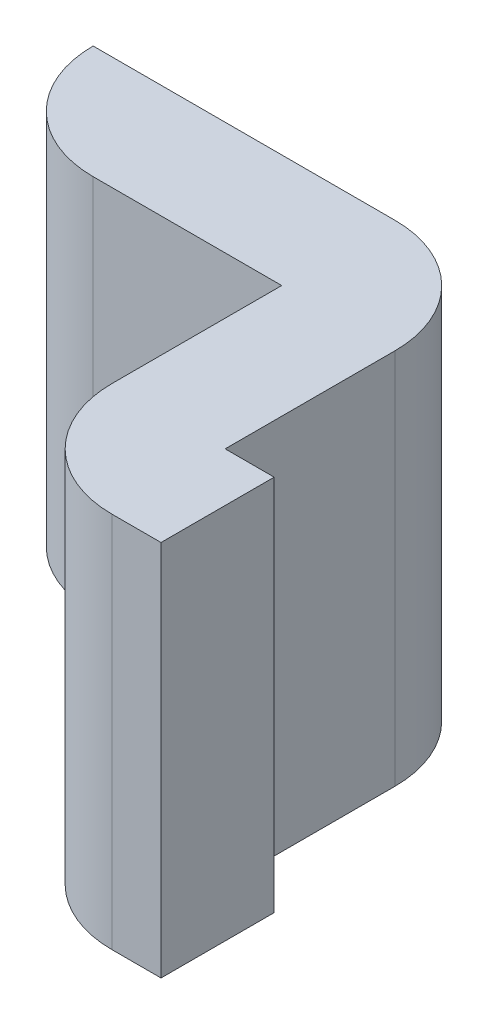
ISO-10303-21;
HEADER;
FILE_DESCRIPTION(('STEP AP214'),'2;1');
FILE_NAME('part.step','',(''),(''),'','','');
FILE_SCHEMA(('AUTOMOTIVE_DESIGN { 1 0 10303 214 1 1 1 1 }'));
ENDSEC;
DATA;
#1=APPLICATION_CONTEXT('core data for automotive mechanical design processes');
#2=APPLICATION_PROTOCOL_DEFINITION('international standard','automotive_design',2000,#1);
#3=PRODUCT_CONTEXT('',#1,'mechanical');
#4=PRODUCT('Part','Part','',(#3));
#5=PRODUCT_RELATED_PRODUCT_CATEGORY('part','',(#4));
#6=PRODUCT_DEFINITION_FORMATION('','',#4);
#7=PRODUCT_DEFINITION_CONTEXT('part definition',#1,'design');
#8=PRODUCT_DEFINITION('design','',#6,#7);
#9=PRODUCT_DEFINITION_SHAPE('','',#8);
#10=(LENGTH_UNIT() NAMED_UNIT(*) SI_UNIT(.MILLI.,.METRE.));
#11=(NAMED_UNIT(*) PLANE_ANGLE_UNIT() SI_UNIT($,.RADIAN.));
#12=(NAMED_UNIT(*) SI_UNIT($,.STERADIAN.) SOLID_ANGLE_UNIT());
#13=UNCERTAINTY_MEASURE_WITH_UNIT(LENGTH_MEASURE(1.E-05),#10,'distance_accuracy_value','');
#14=(GEOMETRIC_REPRESENTATION_CONTEXT(3) GLOBAL_UNCERTAINTY_ASSIGNED_CONTEXT((#13)) GLOBAL_UNIT_ASSIGNED_CONTEXT((#10,
#11,#12)) REPRESENTATION_CONTEXT('',''));
#15=CARTESIAN_POINT('',(0.,0.,0.));
#16=DIRECTION('',(0.,0.,1.));
#17=DIRECTION('',(1.,0.,0.));
#18=AXIS2_PLACEMENT_3D('',#15,#16,#17);
#19=CARTESIAN_POINT('',(3.5179,-0.635,0.9525));
#20=DIRECTION('',(-1.,0.,0.));
#21=DIRECTION('',(0.,0.,1.));
#22=AXIS2_PLACEMENT_3D('',#19,#20,#21);
#23=PLANE('',#22);
#24=DIRECTION('',(0.,-1.,0.));
#25=VECTOR('',#24,1.);
#26=CARTESIAN_POINT('',(3.5179,-0.635,0.381));
#27=LINE('',#26,#25);
#28=CARTESIAN_POINT('',(3.5179,0.635,0.381));
#29=VERTEX_POINT('',#28);
#30=CARTESIAN_POINT('',(3.5179,-0.635,0.381));
#31=VERTEX_POINT('',#30);
#32=EDGE_CURVE('E83',#29,#31,#27,.T.);
#33=ORIENTED_EDGE('',*,*,#32,.F.);
#34=DIRECTION('',(0.,0.,-1.));
#35=VECTOR('',#34,1.);
#36=CARTESIAN_POINT('',(3.5179,0.635,0.));
#37=LINE('',#36,#35);
#38=CARTESIAN_POINT('',(3.5179,0.635,0.9525));
#39=VERTEX_POINT('',#38);
#40=EDGE_CURVE('E80',#29,#39,#37,.F.);
#41=ORIENTED_EDGE('',*,*,#40,.T.);
#42=DIRECTION('',(0.,1.,0.));
#43=VECTOR('',#42,1.);
#44=CARTESIAN_POINT('',(3.5179,-0.635,0.9525));
#45=LINE('',#44,#43);
#46=CARTESIAN_POINT('',(3.5179,-0.635,0.9525));
#47=VERTEX_POINT('',#46);
#48=EDGE_CURVE('E148',#39,#47,#45,.F.);
#49=ORIENTED_EDGE('',*,*,#48,.T.);
#50=DIRECTION('',(0.,0.,-1.));
#51=VECTOR('',#50,1.);
#52=CARTESIAN_POINT('',(3.5179,-0.635,0.));
#53=LINE('',#52,#51);
#54=EDGE_CURVE('E153',#31,#47,#53,.F.);
#55=ORIENTED_EDGE('',*,*,#54,.F.);
#56=EDGE_LOOP('',(#33,#41,#49,#55));
#57=FACE_BOUND('',#56,.T.);
#58=ADVANCED_FACE('F17',(#57),#23,.F.);
#59=CARTESIAN_POINT('',(3.683,-0.635,0.9525));
#60=DIRECTION('',(0.,0.,1.));
#61=DIRECTION('',(1.,0.,0.));
#62=AXIS2_PLACEMENT_3D('',#59,#60,#61);
#63=PLANE('',#62);
#64=ORIENTED_EDGE('',*,*,#48,.F.);
#65=DIRECTION('',(1.,0.,0.));
#66=VECTOR('',#65,1.);
#67=CARTESIAN_POINT('',(2.1209,0.635,0.9525));
#68=LINE('',#67,#66);
#69=CARTESIAN_POINT('',(3.683,0.635,0.9525));
#70=VERTEX_POINT('',#69);
#71=EDGE_CURVE('E118',#39,#70,#68,.T.);
#72=ORIENTED_EDGE('',*,*,#71,.T.);
#73=DIRECTION('',(0.,1.,0.));
#74=VECTOR('',#73,1.);
#75=CARTESIAN_POINT('',(3.683,-0.635,0.9525));
#76=LINE('',#75,#74);
#77=CARTESIAN_POINT('',(3.683,-0.635,0.9525));
#78=VERTEX_POINT('',#77);
#79=EDGE_CURVE('E136',#70,#78,#76,.F.);
#80=ORIENTED_EDGE('',*,*,#79,.T.);
#81=DIRECTION('',(1.,0.,0.));
#82=VECTOR('',#81,1.);
#83=CARTESIAN_POINT('',(2.1209,-0.635,0.9525));
#84=LINE('',#83,#82);
#85=EDGE_CURVE('E143',#47,#78,#84,.T.);
#86=ORIENTED_EDGE('',*,*,#85,.F.);
#87=EDGE_LOOP('',(#64,#72,#80,#86));
#88=FACE_BOUND('',#87,.T.);
#89=ADVANCED_FACE('F315',(#88),#63,.F.);
#90=CARTESIAN_POINT('',(3.683,-0.635,1.3335));
#91=DIRECTION('',(-1.,0.,0.));
#92=DIRECTION('',(0.,0.,1.));
#93=AXIS2_PLACEMENT_3D('',#90,#91,#92);
#94=PLANE('',#93);
#95=ORIENTED_EDGE('',*,*,#79,.F.);
#96=DIRECTION('',(0.,0.,-1.));
#97=VECTOR('',#96,1.);
#98=CARTESIAN_POINT('',(3.683,0.635,0.));
#99=LINE('',#98,#97);
#100=CARTESIAN_POINT('',(3.683,0.635,1.3335));
#101=VERTEX_POINT('',#100);
#102=EDGE_CURVE('E114',#70,#101,#99,.F.);
#103=ORIENTED_EDGE('',*,*,#102,.T.);
#104=DIRECTION('',(0.,1.,0.));
#105=VECTOR('',#104,1.);
#106=CARTESIAN_POINT('',(3.683,-0.635,1.3335));
#107=LINE('',#106,#105);
#108=CARTESIAN_POINT('',(3.683,-0.635,1.3335));
#109=VERTEX_POINT('',#108);
#110=EDGE_CURVE('E133',#101,#109,#107,.F.);
#111=ORIENTED_EDGE('',*,*,#110,.T.);
#112=DIRECTION('',(0.,0.,-1.));
#113=VECTOR('',#112,1.);
#114=CARTESIAN_POINT('',(3.683,-0.635,0.));
#115=LINE('',#114,#113);
#116=EDGE_CURVE('E139',#78,#109,#115,.F.);
#117=ORIENTED_EDGE('',*,*,#116,.F.);
#118=EDGE_LOOP('',(#95,#103,#111,#117));
#119=FACE_BOUND('',#118,.T.);
#120=ADVANCED_FACE('F192',(#119),#94,.F.);
#121=CARTESIAN_POINT('',(3.5179,-0.635,1.3335));
#122=DIRECTION('',(0.,0.,-1.));
#123=DIRECTION('',(-1.,0.,0.));
#124=AXIS2_PLACEMENT_3D('',#121,#122,#123);
#125=PLANE('',#124);
#126=ORIENTED_EDGE('',*,*,#110,.F.);
#127=DIRECTION('',(1.,0.,0.));
#128=VECTOR('',#127,1.);
#129=CARTESIAN_POINT('',(2.1209,0.635,1.3335));
#130=LINE('',#129,#128);
#131=CARTESIAN_POINT('',(3.5179,0.635,1.3335));
#132=VERTEX_POINT('',#131);
#133=EDGE_CURVE('E111',#101,#132,#130,.F.);
#134=ORIENTED_EDGE('',*,*,#133,.T.);
#135=DIRECTION('',(0.,-1.,0.));
#136=VECTOR('',#135,1.);
#137=CARTESIAN_POINT('',(3.5179,-0.635,1.3335));
#138=LINE('',#137,#136);
#139=CARTESIAN_POINT('',(3.5179,-0.635,1.3335));
#140=VERTEX_POINT('',#139);
#141=EDGE_CURVE('E131',#140,#132,#138,.F.);
#142=ORIENTED_EDGE('',*,*,#141,.F.);
#143=DIRECTION('',(1.,0.,0.));
#144=VECTOR('',#143,1.);
#145=CARTESIAN_POINT('',(2.1209,-0.635,1.3335));
#146=LINE('',#145,#144);
#147=EDGE_CURVE('E142',#109,#140,#146,.F.);
#148=ORIENTED_EDGE('',*,*,#147,.F.);
#149=EDGE_LOOP('',(#126,#134,#142,#148));
#150=FACE_BOUND('',#149,.T.);
#151=ADVANCED_FACE('F185',(#150),#125,.F.);
#152=CARTESIAN_POINT('',(3.5179,-0.635,0.9525));
#153=DIRECTION('',(0.,-1.,0.));
#154=DIRECTION('',(0.,0.,-1.));
#155=AXIS2_PLACEMENT_3D('',#152,#153,#154);
#156=CYLINDRICAL_SURFACE('',#155,0.381);
#157=CARTESIAN_POINT('',(3.5179,0.635,0.9525));
#158=DIRECTION('',(0.,-1.,0.));
#159=DIRECTION('',(0.,0.,-1.));
#160=AXIS2_PLACEMENT_3D('',#157,#158,#159);
#161=CIRCLE('',#160,0.381);
#162=CARTESIAN_POINT('',(3.1369,0.635,0.9525));
#163=VERTEX_POINT('',#162);
#164=EDGE_CURVE('E108',#132,#163,#161,.T.);
#165=ORIENTED_EDGE('',*,*,#164,.T.);
#166=DIRECTION('',(0.,1.,0.));
#167=VECTOR('',#166,1.);
#168=CARTESIAN_POINT('',(3.1369,-0.635,0.9525));
#169=LINE('',#168,#167);
#170=CARTESIAN_POINT('',(3.1369,-0.635,0.9525));
#171=VERTEX_POINT('',#170);
#172=EDGE_CURVE('E126',#163,#171,#169,.F.);
#173=ORIENTED_EDGE('',*,*,#172,.T.);
#174=CARTESIAN_POINT('',(3.5179,-0.635,0.9525));
#175=DIRECTION('',(0.,-1.,0.));
#176=DIRECTION('',(0.,0.,-1.));
#177=AXIS2_PLACEMENT_3D('',#174,#175,#176);
#178=CIRCLE('',#177,0.381);
#179=EDGE_CURVE('E169',#140,#171,#178,.T.);
#180=ORIENTED_EDGE('',*,*,#179,.F.);
#181=ORIENTED_EDGE('',*,*,#141,.T.);
#182=EDGE_LOOP('',(#165,#173,#180,#181));
#183=FACE_BOUND('',#182,.T.);
#184=ADVANCED_FACE('F176',(#183),#156,.T.);
#185=CARTESIAN_POINT('',(3.1369,-0.635,0.381));
#186=DIRECTION('',(1.,0.,0.));
#187=DIRECTION('',(0.,0.,-1.));
#188=AXIS2_PLACEMENT_3D('',#185,#186,#187);
#189=PLANE('',#188);
#190=ORIENTED_EDGE('',*,*,#172,.F.);
#191=DIRECTION('',(0.,0.,-1.));
#192=VECTOR('',#191,1.);
#193=CARTESIAN_POINT('',(3.1369,0.635,0.));
#194=LINE('',#193,#192);
#195=CARTESIAN_POINT('',(3.1369,0.635,0.381));
#196=VERTEX_POINT('',#195);
#197=EDGE_CURVE('E103',#163,#196,#194,.T.);
#198=ORIENTED_EDGE('',*,*,#197,.T.);
#199=DIRECTION('',(0.,1.,0.));
#200=VECTOR('',#199,1.);
#201=CARTESIAN_POINT('',(3.1369,-0.635,0.381));
#202=LINE('',#201,#200);
#203=CARTESIAN_POINT('',(3.1369,-0.635,0.381));
#204=VERTEX_POINT('',#203);
#205=EDGE_CURVE('E123',#196,#204,#202,.F.);
#206=ORIENTED_EDGE('',*,*,#205,.T.);
#207=DIRECTION('',(0.,0.,-1.));
#208=VECTOR('',#207,1.);
#209=CARTESIAN_POINT('',(3.1369,-0.635,0.));
#210=LINE('',#209,#208);
#211=EDGE_CURVE('E171',#171,#204,#210,.T.);
#212=ORIENTED_EDGE('',*,*,#211,.F.);
#213=EDGE_LOOP('',(#190,#198,#206,#212));
#214=FACE_BOUND('',#213,.T.);
#215=ADVANCED_FACE('F230',(#214),#189,.F.);
#216=CARTESIAN_POINT('',(2.5019,-0.635,0.381));
#217=DIRECTION('',(0.,0.,-1.));
#218=DIRECTION('',(-1.,0.,0.));
#219=AXIS2_PLACEMENT_3D('',#216,#217,#218);
#220=PLANE('',#219);
#221=ORIENTED_EDGE('',*,*,#205,.F.);
#222=DIRECTION('',(1.,0.,0.));
#223=VECTOR('',#222,1.);
#224=CARTESIAN_POINT('',(2.1209,0.635,0.381));
#225=LINE('',#224,#223);
#226=CARTESIAN_POINT('',(2.5019,0.635,0.381));
#227=VERTEX_POINT('',#226);
#228=EDGE_CURVE('E99',#196,#227,#225,.F.);
#229=ORIENTED_EDGE('',*,*,#228,.T.);
#230=DIRECTION('',(0.,-1.,0.));
#231=VECTOR('',#230,1.);
#232=CARTESIAN_POINT('',(2.5019,-0.635,0.381));
#233=LINE('',#232,#231);
#234=CARTESIAN_POINT('',(2.5019,-0.635,0.381));
#235=VERTEX_POINT('',#234);
#236=EDGE_CURVE('E102',#235,#227,#233,.F.);
#237=ORIENTED_EDGE('',*,*,#236,.F.);
#238=DIRECTION('',(1.,0.,0.));
#239=VECTOR('',#238,1.);
#240=CARTESIAN_POINT('',(2.1209,-0.635,0.381));
#241=LINE('',#240,#239);
#242=EDGE_CURVE('E95',#204,#235,#241,.F.);
#243=ORIENTED_EDGE('',*,*,#242,.F.);
#244=EDGE_LOOP('',(#221,#229,#237,#243));
#245=FACE_BOUND('',#244,.T.);
#246=ADVANCED_FACE('F228',(#245),#220,.F.);
#247=CARTESIAN_POINT('',(3.1369,-0.635,0.381));
#248=DIRECTION('',(0.,-1.,0.));
#249=DIRECTION('',(0.,0.,-1.));
#250=AXIS2_PLACEMENT_3D('',#247,#248,#249);
#251=CYLINDRICAL_SURFACE('',#250,0.381);
#252=CARTESIAN_POINT('',(3.1369,0.635,0.381));
#253=DIRECTION('',(0.,-1.,0.));
#254=DIRECTION('',(0.,0.,-1.));
#255=AXIS2_PLACEMENT_3D('',#252,#253,#254);
#256=CIRCLE('',#255,0.381);
#257=CARTESIAN_POINT('',(3.1369,0.635,0.));
#258=VERTEX_POINT('',#257);
#259=EDGE_CURVE('E20',#258,#29,#256,.T.);
#260=ORIENTED_EDGE('',*,*,#259,.T.);
#261=ORIENTED_EDGE('',*,*,#32,.T.);
#262=CARTESIAN_POINT('',(3.1369,-0.635,0.381));
#263=DIRECTION('',(0.,-1.,0.));
#264=DIRECTION('',(0.,0.,-1.));
#265=AXIS2_PLACEMENT_3D('',#262,#263,#264);
#266=CIRCLE('',#265,0.381);
#267=CARTESIAN_POINT('',(3.1369,-0.635,0.));
#268=VERTEX_POINT('',#267);
#269=EDGE_CURVE('E93',#268,#31,#266,.T.);
#270=ORIENTED_EDGE('',*,*,#269,.F.);
#271=DIRECTION('',(0.,1.,0.));
#272=VECTOR('',#271,1.);
#273=CARTESIAN_POINT('',(3.1369,-0.635,0.));
#274=LINE('',#273,#272);
#275=EDGE_CURVE('E87',#268,#258,#274,.T.);
#276=ORIENTED_EDGE('',*,*,#275,.T.);
#277=EDGE_LOOP('',(#260,#261,#270,#276));
#278=FACE_BOUND('',#277,.T.);
#279=ADVANCED_FACE('F91',(#278),#251,.T.);
#280=CARTESIAN_POINT('',(2.1209,0.635,0.));
#281=DIRECTION('',(0.,-1.,0.));
#282=DIRECTION('',(0.,0.,-1.));
#283=AXIS2_PLACEMENT_3D('',#280,#281,#282);
#284=PLANE('',#283);
#285=ORIENTED_EDGE('',*,*,#228,.F.);
#286=ORIENTED_EDGE('',*,*,#197,.F.);
#287=ORIENTED_EDGE('',*,*,#164,.F.);
#288=ORIENTED_EDGE('',*,*,#133,.F.);
#289=ORIENTED_EDGE('',*,*,#102,.F.);
#290=ORIENTED_EDGE('',*,*,#71,.F.);
#291=ORIENTED_EDGE('',*,*,#40,.F.);
#292=ORIENTED_EDGE('',*,*,#259,.F.);
#293=DIRECTION('',(1.,0.,0.));
#294=VECTOR('',#293,1.);
#295=CARTESIAN_POINT('',(3.1369,0.635,0.));
#296=LINE('',#295,#294);
#297=CARTESIAN_POINT('',(2.1209,0.635,0.));
#298=VERTEX_POINT('',#297);
#299=EDGE_CURVE('E77',#258,#298,#296,.F.);
#300=ORIENTED_EDGE('',*,*,#299,.T.);
#301=CARTESIAN_POINT('',(2.5019,0.635,0.));
#302=DIRECTION('',(0.,-1.,0.));
#303=DIRECTION('',(0.,0.,-1.));
#304=AXIS2_PLACEMENT_3D('',#301,#302,#303);
#305=CIRCLE('',#304,0.381);
#306=EDGE_CURVE('E122',#227,#298,#305,.T.);
#307=ORIENTED_EDGE('',*,*,#306,.F.);
#308=EDGE_LOOP('',(#285,#286,#287,#288,#289,#290,#291,#292,#300,#307));
#309=FACE_BOUND('',#308,.T.);
#310=ADVANCED_FACE('F75',(#309),#284,.F.);
#311=CARTESIAN_POINT('',(2.5019,-0.635,0.));
#312=DIRECTION('',(0.,-1.,0.));
#313=DIRECTION('',(0.,0.,-1.));
#314=AXIS2_PLACEMENT_3D('',#311,#312,#313);
#315=CYLINDRICAL_SURFACE('',#314,0.381);
#316=ORIENTED_EDGE('',*,*,#306,.T.);
#317=DIRECTION('',(0.,1.,0.));
#318=VECTOR('',#317,1.);
#319=CARTESIAN_POINT('',(2.1209,-0.635,0.));
#320=LINE('',#319,#318);
#321=CARTESIAN_POINT('',(2.1209,-0.635,0.));
#322=VERTEX_POINT('',#321);
#323=EDGE_CURVE('E26',#298,#322,#320,.F.);
#324=ORIENTED_EDGE('',*,*,#323,.T.);
#325=CARTESIAN_POINT('',(2.5019,-0.635,0.));
#326=DIRECTION('',(0.,-1.,0.));
#327=DIRECTION('',(0.,0.,-1.));
#328=AXIS2_PLACEMENT_3D('',#325,#326,#327);
#329=CIRCLE('',#328,0.381);
#330=EDGE_CURVE('E34',#235,#322,#329,.T.);
#331=ORIENTED_EDGE('',*,*,#330,.F.);
#332=ORIENTED_EDGE('',*,*,#236,.T.);
#333=EDGE_LOOP('',(#316,#324,#331,#332));
#334=FACE_BOUND('',#333,.T.);
#335=ADVANCED_FACE('F210',(#334),#315,.T.);
#336=CARTESIAN_POINT('',(2.1209,-0.635,0.));
#337=DIRECTION('',(0.,-1.,0.));
#338=DIRECTION('',(0.,0.,-1.));
#339=AXIS2_PLACEMENT_3D('',#336,#337,#338);
#340=PLANE('',#339);
#341=ORIENTED_EDGE('',*,*,#242,.T.);
#342=ORIENTED_EDGE('',*,*,#330,.T.);
#343=DIRECTION('',(1.,0.,0.));
#344=VECTOR('',#343,1.);
#345=CARTESIAN_POINT('',(3.1369,-0.635,0.));
#346=LINE('',#345,#344);
#347=EDGE_CURVE('E11',#322,#268,#346,.T.);
#348=ORIENTED_EDGE('',*,*,#347,.T.);
#349=ORIENTED_EDGE('',*,*,#269,.T.);
#350=ORIENTED_EDGE('',*,*,#54,.T.);
#351=ORIENTED_EDGE('',*,*,#85,.T.);
#352=ORIENTED_EDGE('',*,*,#116,.T.);
#353=ORIENTED_EDGE('',*,*,#147,.T.);
#354=ORIENTED_EDGE('',*,*,#179,.T.);
#355=ORIENTED_EDGE('',*,*,#211,.T.);
#356=EDGE_LOOP('',(#341,#342,#348,#349,#350,#351,#352,#353,#354,#355));
#357=FACE_BOUND('',#356,.T.);
#358=ADVANCED_FACE('F208',(#357),#340,.T.);
#359=CARTESIAN_POINT('',(3.1369,-0.635,0.));
#360=DIRECTION('',(0.,0.,1.));
#361=DIRECTION('',(1.,0.,0.));
#362=AXIS2_PLACEMENT_3D('',#359,#360,#361);
#363=PLANE('',#362);
#364=ORIENTED_EDGE('',*,*,#323,.F.);
#365=ORIENTED_EDGE('',*,*,#299,.F.);
#366=ORIENTED_EDGE('',*,*,#275,.F.);
#367=ORIENTED_EDGE('',*,*,#347,.F.);
#368=EDGE_LOOP('',(#364,#365,#366,#367));
#369=FACE_BOUND('',#368,.T.);
#370=ADVANCED_FACE('F86',(#369),#363,.F.);
#371=CLOSED_SHELL('',(#58,#89,#120,#151,#184,#215,#246,#279,#310,#335,#358,#370));
#372=MANIFOLD_SOLID_BREP('B1',#371);
#373=ADVANCED_BREP_SHAPE_REPRESENTATION('',(#18,#372),#14);
#374=SHAPE_DEFINITION_REPRESENTATION(#9,#373);
ENDSEC;
END-ISO-10303-21;
